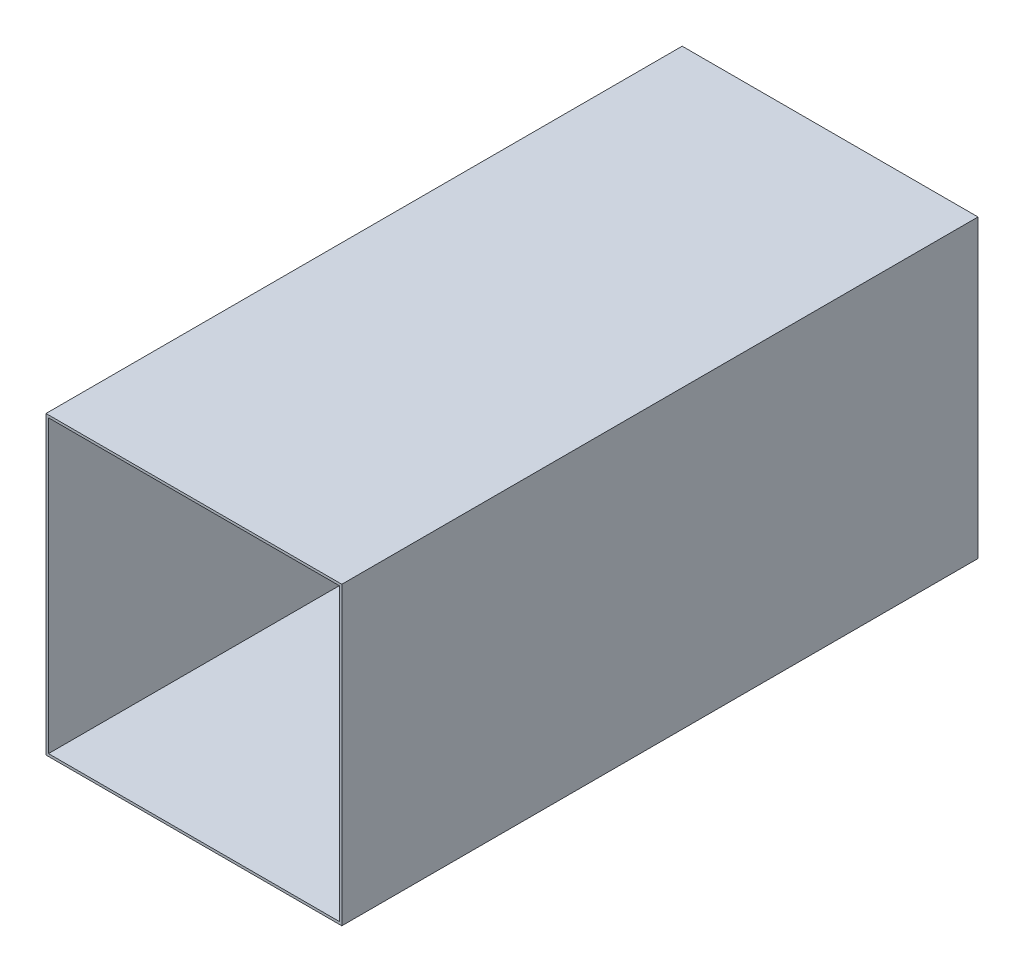
ISO-10303-21;
HEADER;
FILE_DESCRIPTION(('STEP AP214'),'2;1');
FILE_NAME('part.step','',(''),(''),'','','');
FILE_SCHEMA(('AUTOMOTIVE_DESIGN { 1 0 10303 214 1 1 1 1 }'));
ENDSEC;
DATA;
#1=APPLICATION_CONTEXT('core data for automotive mechanical design processes');
#2=APPLICATION_PROTOCOL_DEFINITION('international standard','automotive_design',2000,#1);
#3=PRODUCT_CONTEXT('',#1,'mechanical');
#4=PRODUCT('Part','Part','',(#3));
#5=PRODUCT_RELATED_PRODUCT_CATEGORY('part','',(#4));
#6=PRODUCT_DEFINITION_FORMATION('','',#4);
#7=PRODUCT_DEFINITION_CONTEXT('part definition',#1,'design');
#8=PRODUCT_DEFINITION('design','',#6,#7);
#9=PRODUCT_DEFINITION_SHAPE('','',#8);
#10=(LENGTH_UNIT() NAMED_UNIT(*) SI_UNIT(.MILLI.,.METRE.));
#11=(NAMED_UNIT(*) PLANE_ANGLE_UNIT() SI_UNIT($,.RADIAN.));
#12=(NAMED_UNIT(*) SI_UNIT($,.STERADIAN.) SOLID_ANGLE_UNIT());
#13=UNCERTAINTY_MEASURE_WITH_UNIT(LENGTH_MEASURE(1.E-05),#10,'distance_accuracy_value','');
#14=(GEOMETRIC_REPRESENTATION_CONTEXT(3) GLOBAL_UNCERTAINTY_ASSIGNED_CONTEXT((#13)) GLOBAL_UNIT_ASSIGNED_CONTEXT((#10,
#11,#12)) REPRESENTATION_CONTEXT('',''));
#15=CARTESIAN_POINT('',(0.,0.,0.));
#16=DIRECTION('',(0.,0.,1.));
#17=DIRECTION('',(1.,0.,0.));
#18=AXIS2_PLACEMENT_3D('',#15,#16,#17);
#19=CARTESIAN_POINT('',(0.,0.,1400.));
#20=DIRECTION('',(0.,0.,-1.));
#21=DIRECTION('',(-1.,0.,0.));
#22=AXIS2_PLACEMENT_3D('',#19,#20,#21);
#23=PLANE('',#22);
#24=DIRECTION('',(0.,1.,0.));
#25=VECTOR('',#24,1.);
#26=CARTESIAN_POINT('',(325.5,-325.5,1400.));
#27=LINE('',#26,#25);
#28=CARTESIAN_POINT('',(325.5,-325.5,1400.));
#29=VERTEX_POINT('',#28);
#30=CARTESIAN_POINT('',(325.5,325.5,1400.));
#31=VERTEX_POINT('',#30);
#32=EDGE_CURVE('E159',#29,#31,#27,.T.);
#33=ORIENTED_EDGE('',*,*,#32,.T.);
#34=DIRECTION('',(-1.,0.,0.));
#35=VECTOR('',#34,1.);
#36=CARTESIAN_POINT('',(-325.5,325.5,1400.));
#37=LINE('',#36,#35);
#38=CARTESIAN_POINT('',(-325.5,325.5,1400.));
#39=VERTEX_POINT('',#38);
#40=EDGE_CURVE('E163',#31,#39,#37,.T.);
#41=ORIENTED_EDGE('',*,*,#40,.T.);
#42=DIRECTION('',(0.,-1.,0.));
#43=VECTOR('',#42,1.);
#44=CARTESIAN_POINT('',(-325.5,-325.5,1400.));
#45=LINE('',#44,#43);
#46=CARTESIAN_POINT('',(-325.5,-325.5,1400.));
#47=VERTEX_POINT('',#46);
#48=EDGE_CURVE('E167',#39,#47,#45,.T.);
#49=ORIENTED_EDGE('',*,*,#48,.T.);
#50=DIRECTION('',(1.,0.,0.));
#51=VECTOR('',#50,1.);
#52=CARTESIAN_POINT('',(-325.5,-325.5,1400.));
#53=LINE('',#52,#51);
#54=EDGE_CURVE('E170',#47,#29,#53,.T.);
#55=ORIENTED_EDGE('',*,*,#54,.T.);
#56=EDGE_LOOP('',(#33,#41,#49,#55));
#57=FACE_BOUND('',#56,.T.);
#58=DIRECTION('',(0.,1.,0.));
#59=VECTOR('',#58,1.);
#60=CARTESIAN_POINT('',(320.,-320.,1400.));
#61=LINE('',#60,#59);
#62=CARTESIAN_POINT('',(320.,-320.,1400.));
#63=VERTEX_POINT('',#62);
#64=CARTESIAN_POINT('',(320.,320.,1400.));
#65=VERTEX_POINT('',#64);
#66=EDGE_CURVE('E111',#63,#65,#61,.T.);
#67=ORIENTED_EDGE('',*,*,#66,.F.);
#68=DIRECTION('',(1.,0.,0.));
#69=VECTOR('',#68,1.);
#70=CARTESIAN_POINT('',(-320.,-320.,1400.));
#71=LINE('',#70,#69);
#72=CARTESIAN_POINT('',(-320.,-320.,1400.));
#73=VERTEX_POINT('',#72);
#74=EDGE_CURVE('E137',#73,#63,#71,.T.);
#75=ORIENTED_EDGE('',*,*,#74,.F.);
#76=DIRECTION('',(0.,-1.,0.));
#77=VECTOR('',#76,1.);
#78=CARTESIAN_POINT('',(-320.,-320.,1400.));
#79=LINE('',#78,#77);
#80=CARTESIAN_POINT('',(-320.,320.,1400.));
#81=VERTEX_POINT('',#80);
#82=EDGE_CURVE('E133',#81,#73,#79,.T.);
#83=ORIENTED_EDGE('',*,*,#82,.F.);
#84=DIRECTION('',(-1.,0.,0.));
#85=VECTOR('',#84,1.);
#86=CARTESIAN_POINT('',(-320.,320.,1400.));
#87=LINE('',#86,#85);
#88=EDGE_CURVE('E120',#65,#81,#87,.T.);
#89=ORIENTED_EDGE('',*,*,#88,.F.);
#90=EDGE_LOOP('',(#67,#75,#83,#89));
#91=FACE_BOUND('',#90,.T.);
#92=ADVANCED_FACE('F45',(#57,#91),#23,.F.);
#93=CARTESIAN_POINT('',(0.,0.,0.));
#94=DIRECTION('',(0.,0.,-1.));
#95=DIRECTION('',(-1.,0.,0.));
#96=AXIS2_PLACEMENT_3D('',#93,#94,#95);
#97=PLANE('',#96);
#98=DIRECTION('',(0.,1.,0.));
#99=VECTOR('',#98,1.);
#100=CARTESIAN_POINT('',(325.5,-325.5,0.));
#101=LINE('',#100,#99);
#102=CARTESIAN_POINT('',(325.5,-325.5,0.));
#103=VERTEX_POINT('',#102);
#104=CARTESIAN_POINT('',(325.5,325.5,0.));
#105=VERTEX_POINT('',#104);
#106=EDGE_CURVE('E129',#103,#105,#101,.T.);
#107=ORIENTED_EDGE('',*,*,#106,.F.);
#108=DIRECTION('',(1.,0.,0.));
#109=VECTOR('',#108,1.);
#110=CARTESIAN_POINT('',(-325.5,-325.5,0.));
#111=LINE('',#110,#109);
#112=CARTESIAN_POINT('',(-325.5,-325.5,0.));
#113=VERTEX_POINT('',#112);
#114=EDGE_CURVE('E164',#113,#103,#111,.T.);
#115=ORIENTED_EDGE('',*,*,#114,.F.);
#116=DIRECTION('',(0.,-1.,0.));
#117=VECTOR('',#116,1.);
#118=CARTESIAN_POINT('',(-325.5,-325.5,0.));
#119=LINE('',#118,#117);
#120=CARTESIAN_POINT('',(-325.5,325.5,0.));
#121=VERTEX_POINT('',#120);
#122=EDGE_CURVE('E180',#121,#113,#119,.T.);
#123=ORIENTED_EDGE('',*,*,#122,.F.);
#124=DIRECTION('',(-1.,0.,0.));
#125=VECTOR('',#124,1.);
#126=CARTESIAN_POINT('',(-325.5,325.5,0.));
#127=LINE('',#126,#125);
#128=EDGE_CURVE('E177',#105,#121,#127,.T.);
#129=ORIENTED_EDGE('',*,*,#128,.F.);
#130=EDGE_LOOP('',(#107,#115,#123,#129));
#131=FACE_BOUND('',#130,.T.);
#132=DIRECTION('',(1.,0.,0.));
#133=VECTOR('',#132,1.);
#134=CARTESIAN_POINT('',(-320.,-320.,0.));
#135=LINE('',#134,#133);
#136=CARTESIAN_POINT('',(-320.,-320.,0.));
#137=VERTEX_POINT('',#136);
#138=CARTESIAN_POINT('',(320.,-320.,0.));
#139=VERTEX_POINT('',#138);
#140=EDGE_CURVE('E121',#137,#139,#135,.T.);
#141=ORIENTED_EDGE('',*,*,#140,.T.);
#142=DIRECTION('',(0.,1.,0.));
#143=VECTOR('',#142,1.);
#144=CARTESIAN_POINT('',(320.,-320.,0.));
#145=LINE('',#144,#143);
#146=CARTESIAN_POINT('',(320.,320.,0.));
#147=VERTEX_POINT('',#146);
#148=EDGE_CURVE('E69',#139,#147,#145,.T.);
#149=ORIENTED_EDGE('',*,*,#148,.T.);
#150=DIRECTION('',(-1.,0.,0.));
#151=VECTOR('',#150,1.);
#152=CARTESIAN_POINT('',(-320.,320.,0.));
#153=LINE('',#152,#151);
#154=CARTESIAN_POINT('',(-320.,320.,0.));
#155=VERTEX_POINT('',#154);
#156=EDGE_CURVE('E127',#147,#155,#153,.T.);
#157=ORIENTED_EDGE('',*,*,#156,.T.);
#158=DIRECTION('',(0.,-1.,0.));
#159=VECTOR('',#158,1.);
#160=CARTESIAN_POINT('',(-320.,-320.,0.));
#161=LINE('',#160,#159);
#162=EDGE_CURVE('E146',#155,#137,#161,.T.);
#163=ORIENTED_EDGE('',*,*,#162,.T.);
#164=EDGE_LOOP('',(#141,#149,#157,#163));
#165=FACE_BOUND('',#164,.T.);
#166=ADVANCED_FACE('F203',(#131,#165),#97,.T.);
#167=CARTESIAN_POINT('',(325.5,-325.5,1400.));
#168=DIRECTION('',(-1.,0.,0.));
#169=DIRECTION('',(0.,0.,1.));
#170=AXIS2_PLACEMENT_3D('',#167,#168,#169);
#171=PLANE('',#170);
#172=ORIENTED_EDGE('',*,*,#106,.T.);
#173=DIRECTION('',(0.,0.,-1.));
#174=VECTOR('',#173,1.);
#175=CARTESIAN_POINT('',(325.5,325.5,1400.));
#176=LINE('',#175,#174);
#177=EDGE_CURVE('E11',#31,#105,#176,.T.);
#178=ORIENTED_EDGE('',*,*,#177,.F.);
#179=ORIENTED_EDGE('',*,*,#32,.F.);
#180=DIRECTION('',(0.,0.,-1.));
#181=VECTOR('',#180,1.);
#182=CARTESIAN_POINT('',(325.5,-325.5,1400.));
#183=LINE('',#182,#181);
#184=EDGE_CURVE('E173',#29,#103,#183,.T.);
#185=ORIENTED_EDGE('',*,*,#184,.T.);
#186=EDGE_LOOP('',(#172,#178,#179,#185));
#187=FACE_BOUND('',#186,.T.);
#188=ADVANCED_FACE('F47',(#187),#171,.F.);
#189=CARTESIAN_POINT('',(-325.5,325.5,1400.));
#190=DIRECTION('',(0.,-1.,0.));
#191=DIRECTION('',(0.,0.,-1.));
#192=AXIS2_PLACEMENT_3D('',#189,#190,#191);
#193=PLANE('',#192);
#194=ORIENTED_EDGE('',*,*,#128,.T.);
#195=DIRECTION('',(0.,0.,-1.));
#196=VECTOR('',#195,1.);
#197=CARTESIAN_POINT('',(-325.5,325.5,1400.));
#198=LINE('',#197,#196);
#199=EDGE_CURVE('E54',#39,#121,#198,.T.);
#200=ORIENTED_EDGE('',*,*,#199,.F.);
#201=ORIENTED_EDGE('',*,*,#40,.F.);
#202=ORIENTED_EDGE('',*,*,#177,.T.);
#203=EDGE_LOOP('',(#194,#200,#201,#202));
#204=FACE_BOUND('',#203,.T.);
#205=ADVANCED_FACE('F213',(#204),#193,.F.);
#206=CARTESIAN_POINT('',(-325.5,-325.5,1400.));
#207=DIRECTION('',(1.,0.,0.));
#208=DIRECTION('',(0.,0.,-1.));
#209=AXIS2_PLACEMENT_3D('',#206,#207,#208);
#210=PLANE('',#209);
#211=ORIENTED_EDGE('',*,*,#122,.T.);
#212=DIRECTION('',(0.,0.,-1.));
#213=VECTOR('',#212,1.);
#214=CARTESIAN_POINT('',(-325.5,-325.5,1400.));
#215=LINE('',#214,#213);
#216=EDGE_CURVE('E188',#47,#113,#215,.T.);
#217=ORIENTED_EDGE('',*,*,#216,.F.);
#218=ORIENTED_EDGE('',*,*,#48,.F.);
#219=ORIENTED_EDGE('',*,*,#199,.T.);
#220=EDGE_LOOP('',(#211,#217,#218,#219));
#221=FACE_BOUND('',#220,.T.);
#222=ADVANCED_FACE('F197',(#221),#210,.F.);
#223=CARTESIAN_POINT('',(-325.5,-325.5,1400.));
#224=DIRECTION('',(0.,1.,0.));
#225=DIRECTION('',(0.,0.,1.));
#226=AXIS2_PLACEMENT_3D('',#223,#224,#225);
#227=PLANE('',#226);
#228=ORIENTED_EDGE('',*,*,#114,.T.);
#229=ORIENTED_EDGE('',*,*,#184,.F.);
#230=ORIENTED_EDGE('',*,*,#54,.F.);
#231=ORIENTED_EDGE('',*,*,#216,.T.);
#232=EDGE_LOOP('',(#228,#229,#230,#231));
#233=FACE_BOUND('',#232,.T.);
#234=ADVANCED_FACE('F207',(#233),#227,.F.);
#235=CARTESIAN_POINT('',(320.,-320.,1400.));
#236=DIRECTION('',(-1.,0.,0.));
#237=DIRECTION('',(0.,0.,1.));
#238=AXIS2_PLACEMENT_3D('',#235,#236,#237);
#239=PLANE('',#238);
#240=ORIENTED_EDGE('',*,*,#148,.F.);
#241=DIRECTION('',(0.,0.,-1.));
#242=VECTOR('',#241,1.);
#243=CARTESIAN_POINT('',(320.,-320.,1400.));
#244=LINE('',#243,#242);
#245=EDGE_CURVE('E115',#63,#139,#244,.T.);
#246=ORIENTED_EDGE('',*,*,#245,.F.);
#247=ORIENTED_EDGE('',*,*,#66,.T.);
#248=DIRECTION('',(0.,0.,-1.));
#249=VECTOR('',#248,1.);
#250=CARTESIAN_POINT('',(320.,320.,1400.));
#251=LINE('',#250,#249);
#252=EDGE_CURVE('E114',#65,#147,#251,.T.);
#253=ORIENTED_EDGE('',*,*,#252,.T.);
#254=EDGE_LOOP('',(#240,#246,#247,#253));
#255=FACE_BOUND('',#254,.T.);
#256=ADVANCED_FACE('F113',(#255),#239,.T.);
#257=CARTESIAN_POINT('',(-320.,320.,1400.));
#258=DIRECTION('',(0.,-1.,0.));
#259=DIRECTION('',(0.,0.,-1.));
#260=AXIS2_PLACEMENT_3D('',#257,#258,#259);
#261=PLANE('',#260);
#262=ORIENTED_EDGE('',*,*,#156,.F.);
#263=ORIENTED_EDGE('',*,*,#252,.F.);
#264=ORIENTED_EDGE('',*,*,#88,.T.);
#265=DIRECTION('',(0.,0.,-1.));
#266=VECTOR('',#265,1.);
#267=CARTESIAN_POINT('',(-320.,320.,1400.));
#268=LINE('',#267,#266);
#269=EDGE_CURVE('E130',#81,#155,#268,.T.);
#270=ORIENTED_EDGE('',*,*,#269,.T.);
#271=EDGE_LOOP('',(#262,#263,#264,#270));
#272=FACE_BOUND('',#271,.T.);
#273=ADVANCED_FACE('F124',(#272),#261,.T.);
#274=CARTESIAN_POINT('',(-320.,-320.,1400.));
#275=DIRECTION('',(1.,0.,0.));
#276=DIRECTION('',(0.,0.,-1.));
#277=AXIS2_PLACEMENT_3D('',#274,#275,#276);
#278=PLANE('',#277);
#279=ORIENTED_EDGE('',*,*,#162,.F.);
#280=ORIENTED_EDGE('',*,*,#269,.F.);
#281=ORIENTED_EDGE('',*,*,#82,.T.);
#282=DIRECTION('',(0.,0.,-1.));
#283=VECTOR('',#282,1.);
#284=CARTESIAN_POINT('',(-320.,-320.,1400.));
#285=LINE('',#284,#283);
#286=EDGE_CURVE('E61',#73,#137,#285,.T.);
#287=ORIENTED_EDGE('',*,*,#286,.T.);
#288=EDGE_LOOP('',(#279,#280,#281,#287));
#289=FACE_BOUND('',#288,.T.);
#290=ADVANCED_FACE('F236',(#289),#278,.T.);
#291=CARTESIAN_POINT('',(-320.,-320.,1400.));
#292=DIRECTION('',(0.,1.,0.));
#293=DIRECTION('',(-1.,0.,0.));
#294=AXIS2_PLACEMENT_3D('',#291,#292,#293);
#295=PLANE('',#294);
#296=ORIENTED_EDGE('',*,*,#140,.F.);
#297=ORIENTED_EDGE('',*,*,#286,.F.);
#298=ORIENTED_EDGE('',*,*,#74,.T.);
#299=ORIENTED_EDGE('',*,*,#245,.T.);
#300=EDGE_LOOP('',(#296,#297,#298,#299));
#301=FACE_BOUND('',#300,.T.);
#302=ADVANCED_FACE('F240',(#301),#295,.T.);
#303=CLOSED_SHELL('',(#92,#166,#188,#205,#222,#234,#256,#273,#290,#302));
#304=MANIFOLD_SOLID_BREP('B2',#303);
#305=ADVANCED_BREP_SHAPE_REPRESENTATION('',(#18,#304),#14);
#306=SHAPE_DEFINITION_REPRESENTATION(#9,#305);
ENDSEC;
END-ISO-10303-21;
